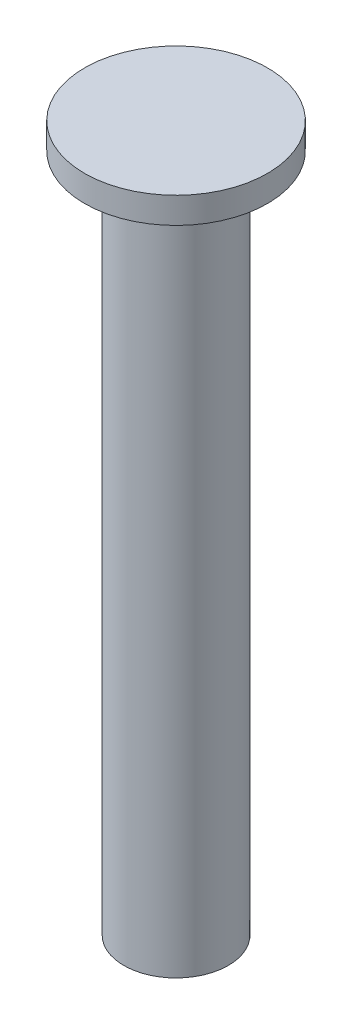
ISO-10303-21;
HEADER;
FILE_DESCRIPTION(('STEP AP214'),'2;1');
FILE_NAME('part.step','',(''),(''),'','','');
FILE_SCHEMA(('AUTOMOTIVE_DESIGN { 1 0 10303 214 1 1 1 1 }'));
ENDSEC;
DATA;
#1=APPLICATION_CONTEXT('core data for automotive mechanical design processes');
#2=APPLICATION_PROTOCOL_DEFINITION('international standard','automotive_design',2000,#1);
#3=PRODUCT_CONTEXT('',#1,'mechanical');
#4=PRODUCT('Part','Part','',(#3));
#5=PRODUCT_RELATED_PRODUCT_CATEGORY('part','',(#4));
#6=PRODUCT_DEFINITION_FORMATION('','',#4);
#7=PRODUCT_DEFINITION_CONTEXT('part definition',#1,'design');
#8=PRODUCT_DEFINITION('design','',#6,#7);
#9=PRODUCT_DEFINITION_SHAPE('','',#8);
#10=(LENGTH_UNIT() NAMED_UNIT(*) SI_UNIT(.MILLI.,.METRE.));
#11=(NAMED_UNIT(*) PLANE_ANGLE_UNIT() SI_UNIT($,.RADIAN.));
#12=(NAMED_UNIT(*) SI_UNIT($,.STERADIAN.) SOLID_ANGLE_UNIT());
#13=UNCERTAINTY_MEASURE_WITH_UNIT(LENGTH_MEASURE(1.E-05),#10,'distance_accuracy_value','');
#14=(GEOMETRIC_REPRESENTATION_CONTEXT(3) GLOBAL_UNCERTAINTY_ASSIGNED_CONTEXT((#13)) GLOBAL_UNIT_ASSIGNED_CONTEXT((#10,
#11,#12)) REPRESENTATION_CONTEXT('',''));
#15=CARTESIAN_POINT('',(0.,0.,0.));
#16=DIRECTION('',(0.,0.,1.));
#17=DIRECTION('',(1.,0.,0.));
#18=AXIS2_PLACEMENT_3D('',#15,#16,#17);
#19=CARTESIAN_POINT('',(0.,26.,0.));
#20=DIRECTION('',(0.,-1.,0.));
#21=DIRECTION('',(0.,0.,-1.));
#22=AXIS2_PLACEMENT_3D('',#19,#20,#21);
#23=CYLINDRICAL_SURFACE('',#22,2.);
#24=CARTESIAN_POINT('',(0.,26.,0.));
#25=DIRECTION('',(0.,1.,0.));
#26=DIRECTION('',(0.,0.,1.));
#27=AXIS2_PLACEMENT_3D('',#24,#25,#26);
#28=CIRCLE('',#27,2.);
#29=CARTESIAN_POINT('',(0.,26.,-2.));
#30=VERTEX_POINT('',#29);
#31=EDGE_CURVE('E10',#30,#30,#28,.T.);
#32=CARTESIAN_POINT('',(0.,0.,0.));
#33=DIRECTION('',(0.,1.,0.));
#34=DIRECTION('',(0.,0.,1.));
#35=AXIS2_PLACEMENT_3D('',#32,#33,#34);
#36=CIRCLE('',#35,2.);
#37=CARTESIAN_POINT('',(0.,0.,-2.));
#38=VERTEX_POINT('',#37);
#39=EDGE_CURVE('E40',#38,#38,#36,.T.);
#40=CARTESIAN_POINT('',(0.,26.,-2.));
#41=CARTESIAN_POINT('',(0.,25.7291666666667,-2.));
#42=CARTESIAN_POINT('',(0.,25.4583333333333,-2.));
#43=CARTESIAN_POINT('',(0.,24.9166666666667,-2.));
#44=CARTESIAN_POINT('',(0.,24.6458333333333,-2.));
#45=CARTESIAN_POINT('',(0.,24.1041666666667,-2.));
#46=CARTESIAN_POINT('',(0.,23.8333333333333,-2.));
#47=CARTESIAN_POINT('',(0.,23.2916666666667,-2.));
#48=CARTESIAN_POINT('',(0.,23.0208333333333,-2.));
#49=CARTESIAN_POINT('',(0.,22.4791666666667,-2.));
#50=CARTESIAN_POINT('',(0.,22.2083333333333,-2.));
#51=CARTESIAN_POINT('',(0.,21.6666666666667,-2.));
#52=CARTESIAN_POINT('',(0.,21.3958333333333,-2.));
#53=CARTESIAN_POINT('',(0.,20.8541666666667,-2.));
#54=CARTESIAN_POINT('',(0.,20.5833333333333,-2.));
#55=CARTESIAN_POINT('',(0.,20.0416666666667,-2.));
#56=CARTESIAN_POINT('',(0.,19.7708333333333,-2.));
#57=CARTESIAN_POINT('',(0.,19.2291666666667,-2.));
#58=CARTESIAN_POINT('',(0.,18.9583333333333,-2.));
#59=CARTESIAN_POINT('',(0.,18.4166666666667,-2.));
#60=CARTESIAN_POINT('',(0.,18.1458333333333,-2.));
#61=CARTESIAN_POINT('',(0.,17.6041666666667,-2.));
#62=CARTESIAN_POINT('',(0.,17.3333333333333,-2.));
#63=CARTESIAN_POINT('',(0.,16.7916666666667,-2.));
#64=CARTESIAN_POINT('',(0.,16.5208333333333,-2.));
#65=CARTESIAN_POINT('',(0.,15.9791666666667,-2.));
#66=CARTESIAN_POINT('',(0.,15.7083333333333,-2.));
#67=CARTESIAN_POINT('',(0.,15.1666666666667,-2.));
#68=CARTESIAN_POINT('',(0.,14.8958333333333,-2.));
#69=CARTESIAN_POINT('',(0.,14.3541666666667,-2.));
#70=CARTESIAN_POINT('',(0.,14.0833333333333,-2.));
#71=CARTESIAN_POINT('',(0.,13.5416666666667,-2.));
#72=CARTESIAN_POINT('',(0.,13.2708333333333,-2.));
#73=CARTESIAN_POINT('',(0.,12.7291666666667,-2.));
#74=CARTESIAN_POINT('',(0.,12.4583333333333,-2.));
#75=CARTESIAN_POINT('',(0.,11.9166666666667,-2.));
#76=CARTESIAN_POINT('',(0.,11.6458333333333,-2.));
#77=CARTESIAN_POINT('',(0.,11.1041666666667,-2.));
#78=CARTESIAN_POINT('',(0.,10.8333333333333,-2.));
#79=CARTESIAN_POINT('',(0.,10.2916666666667,-2.));
#80=CARTESIAN_POINT('',(0.,10.0208333333333,-2.));
#81=CARTESIAN_POINT('',(0.,9.47916666666667,-2.));
#82=CARTESIAN_POINT('',(0.,9.20833333333333,-2.));
#83=CARTESIAN_POINT('',(0.,8.66666666666667,-2.));
#84=CARTESIAN_POINT('',(0.,8.39583333333333,-2.));
#85=CARTESIAN_POINT('',(0.,7.85416666666667,-2.));
#86=CARTESIAN_POINT('',(0.,7.58333333333333,-2.));
#87=CARTESIAN_POINT('',(0.,7.04166666666667,-2.));
#88=CARTESIAN_POINT('',(0.,6.77083333333333,-2.));
#89=CARTESIAN_POINT('',(0.,6.22916666666667,-2.));
#90=CARTESIAN_POINT('',(0.,5.95833333333333,-2.));
#91=CARTESIAN_POINT('',(0.,5.41666666666667,-2.));
#92=CARTESIAN_POINT('',(0.,5.14583333333333,-2.));
#93=CARTESIAN_POINT('',(0.,4.60416666666667,-2.));
#94=CARTESIAN_POINT('',(0.,4.33333333333333,-2.));
#95=CARTESIAN_POINT('',(0.,3.79166666666667,-2.));
#96=CARTESIAN_POINT('',(0.,3.52083333333333,-2.));
#97=CARTESIAN_POINT('',(0.,2.97916666666667,-2.));
#98=CARTESIAN_POINT('',(0.,2.70833333333333,-2.));
#99=CARTESIAN_POINT('',(0.,2.16666666666667,-2.));
#100=CARTESIAN_POINT('',(0.,1.89583333333333,-2.));
#101=CARTESIAN_POINT('',(0.,1.35416666666667,-2.));
#102=CARTESIAN_POINT('',(0.,1.08333333333333,-2.));
#103=CARTESIAN_POINT('',(0.,0.541666666666667,-2.));
#104=CARTESIAN_POINT('',(0.,0.270833333333334,-2.));
#105=CARTESIAN_POINT('',(0.,0.,-2.));
#106=B_SPLINE_CURVE_WITH_KNOTS('',3,(#40,#41,#42,#43,#44,#45,#46,#47,#48,#49,#50,#51,#52,#53,
#54,#55,#56,#57,#58,#59,#60,#61,#62,#63,#64,#65,#66,#67,#68,#69,#70,#71,#72,#73,#74,#75,#76,#77,
#78,#79,#80,#81,#82,#83,#84,#85,#86,#87,#88,#89,#90,#91,#92,#93,#94,#95,#96,#97,#98,#99,#100,
#101,#102,#103,#104,#105),.UNSPECIFIED.,.F.,.F.,(4,2,2,2,2,2,2,2,2,2,2,2,2,2,2,2,2,2,2,2,2,2,2,
2,2,2,2,2,2,2,2,2,4),(0.,0.812500000000001,1.625,2.4375,3.25,4.0625,4.875,5.6875,6.5,7.3125,
8.125,8.9375,9.75,10.5625,11.375,12.1875,13.,13.8125,14.625,15.4375,16.25,17.0625,17.875,
18.6875,19.5,20.3125,21.125,21.9375,22.75,23.5625,24.375,25.1875,26.),.UNSPECIFIED.);
#107=EDGE_CURVE('BSEAM37',#30,#38,#106,.T.);
#108=ORIENTED_EDGE('',*,*,#31,.F.);
#109=ORIENTED_EDGE('',*,*,#39,.T.);
#110=ORIENTED_EDGE('',*,*,#107,.T.);
#111=ORIENTED_EDGE('',*,*,#107,.F.);
#112=EDGE_LOOP('',(#108,#110,#109,#111));
#113=FACE_BOUND('',#112,.T.);
#114=ADVANCED_FACE('F37',(#113),#23,.T.);
#115=CARTESIAN_POINT('',(0.,0.,0.));
#116=DIRECTION('',(0.,1.,0.));
#117=DIRECTION('',(0.,0.,1.));
#118=AXIS2_PLACEMENT_3D('',#115,#116,#117);
#119=PLANE('',#118);
#120=ORIENTED_EDGE('',*,*,#39,.F.);
#121=EDGE_LOOP('',(#120));
#122=FACE_BOUND('',#121,.T.);
#123=ADVANCED_FACE('F64',(#122),#119,.F.);
#124=CARTESIAN_POINT('',(0.,27.,0.));
#125=DIRECTION('',(0.,-1.,0.));
#126=DIRECTION('',(0.,0.,-1.));
#127=AXIS2_PLACEMENT_3D('',#124,#125,#126);
#128=CYLINDRICAL_SURFACE('',#127,3.5);
#129=CARTESIAN_POINT('',(0.,27.,0.));
#130=DIRECTION('',(0.,1.,0.));
#131=DIRECTION('',(0.,0.,1.));
#132=AXIS2_PLACEMENT_3D('',#129,#130,#131);
#133=CIRCLE('',#132,3.5);
#134=CARTESIAN_POINT('',(0.,27.,3.5));
#135=VERTEX_POINT('',#134);
#136=EDGE_CURVE('E49',#135,#135,#133,.T.);
#137=ORIENTED_EDGE('',*,*,#136,.F.);
#138=EDGE_LOOP('',(#137));
#139=FACE_BOUND('',#138,.T.);
#140=CARTESIAN_POINT('',(0.,26.,0.));
#141=DIRECTION('',(0.,1.,0.));
#142=DIRECTION('',(0.,0.,1.));
#143=AXIS2_PLACEMENT_3D('',#140,#141,#142);
#144=CIRCLE('',#143,3.5);
#145=CARTESIAN_POINT('',(0.,26.,3.5));
#146=VERTEX_POINT('',#145);
#147=EDGE_CURVE('E51',#146,#146,#144,.T.);
#148=ORIENTED_EDGE('',*,*,#147,.T.);
#149=EDGE_LOOP('',(#148));
#150=FACE_BOUND('',#149,.T.);
#151=ADVANCED_FACE('F61',(#139,#150),#128,.T.);
#152=CARTESIAN_POINT('',(0.,27.,0.));
#153=DIRECTION('',(0.,1.,0.));
#154=DIRECTION('',(0.,0.,1.));
#155=AXIS2_PLACEMENT_3D('',#152,#153,#154);
#156=PLANE('',#155);
#157=ORIENTED_EDGE('',*,*,#136,.T.);
#158=EDGE_LOOP('',(#157));
#159=FACE_BOUND('',#158,.T.);
#160=ADVANCED_FACE('F59',(#159),#156,.T.);
#161=CARTESIAN_POINT('',(0.,26.,0.));
#162=DIRECTION('',(0.,1.,0.));
#163=DIRECTION('',(0.,0.,1.));
#164=AXIS2_PLACEMENT_3D('',#161,#162,#163);
#165=PLANE('',#164);
#166=ORIENTED_EDGE('',*,*,#31,.T.);
#167=EDGE_LOOP('',(#166));
#168=FACE_BOUND('',#167,.T.);
#169=ORIENTED_EDGE('',*,*,#147,.F.);
#170=EDGE_LOOP('',(#169));
#171=FACE_BOUND('',#170,.T.);
#172=ADVANCED_FACE('F68',(#168,#171),#165,.F.);
#173=CLOSED_SHELL('',(#114,#123,#151,#160,#172));
#174=MANIFOLD_SOLID_BREP('B2',#173);
#175=ADVANCED_BREP_SHAPE_REPRESENTATION('',(#18,#174),#14);
#176=SHAPE_DEFINITION_REPRESENTATION(#9,#175);
ENDSEC;
END-ISO-10303-21;
